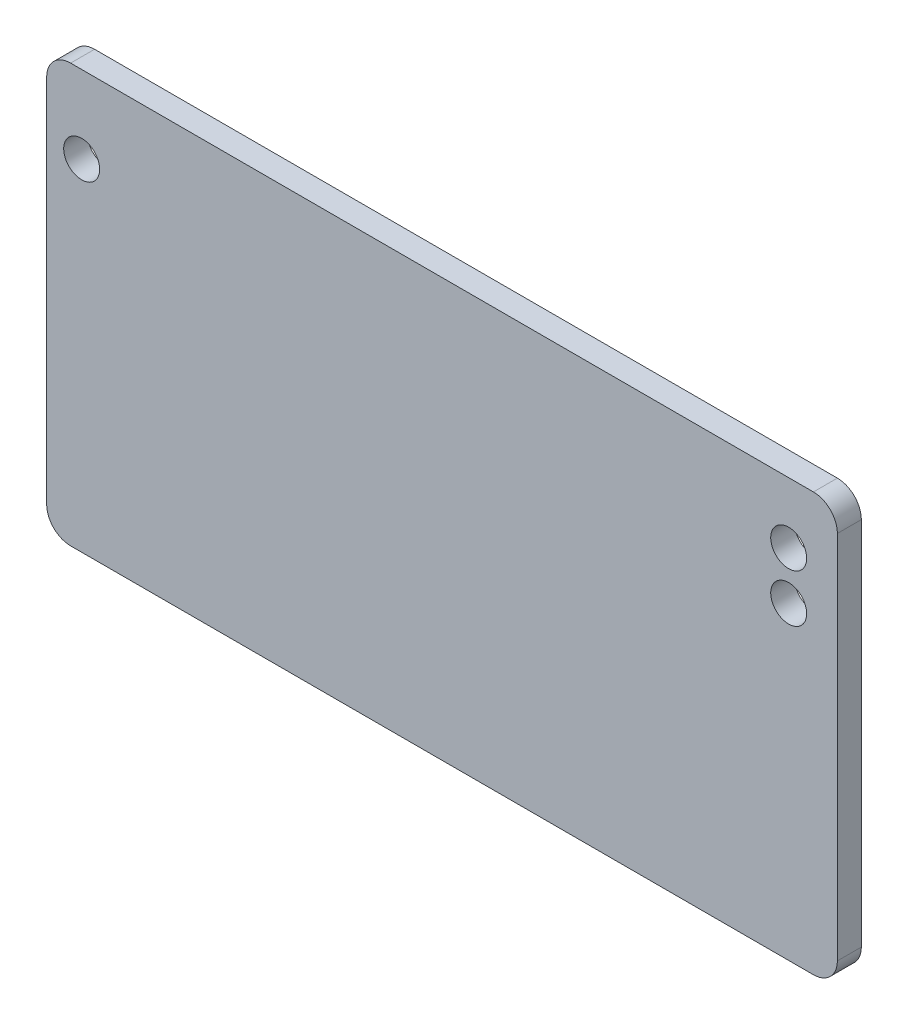
ISO-10303-21;
HEADER;
FILE_DESCRIPTION(('STEP AP214'),'2;1');
FILE_NAME('part.step','',(''),(''),'','','');
FILE_SCHEMA(('AUTOMOTIVE_DESIGN { 1 0 10303 214 1 1 1 1 }'));
ENDSEC;
DATA;
#1=APPLICATION_CONTEXT('core data for automotive mechanical design processes');
#2=APPLICATION_PROTOCOL_DEFINITION('international standard','automotive_design',2000,#1);
#3=PRODUCT_CONTEXT('',#1,'mechanical');
#4=PRODUCT('Part','Part','',(#3));
#5=PRODUCT_RELATED_PRODUCT_CATEGORY('part','',(#4));
#6=PRODUCT_DEFINITION_FORMATION('','',#4);
#7=PRODUCT_DEFINITION_CONTEXT('part definition',#1,'design');
#8=PRODUCT_DEFINITION('design','',#6,#7);
#9=PRODUCT_DEFINITION_SHAPE('','',#8);
#10=(LENGTH_UNIT() NAMED_UNIT(*) SI_UNIT(.MILLI.,.METRE.));
#11=(NAMED_UNIT(*) PLANE_ANGLE_UNIT() SI_UNIT($,.RADIAN.));
#12=(NAMED_UNIT(*) SI_UNIT($,.STERADIAN.) SOLID_ANGLE_UNIT());
#13=UNCERTAINTY_MEASURE_WITH_UNIT(LENGTH_MEASURE(1.E-05),#10,'distance_accuracy_value','');
#14=(GEOMETRIC_REPRESENTATION_CONTEXT(3) GLOBAL_UNCERTAINTY_ASSIGNED_CONTEXT((#13)) GLOBAL_UNIT_ASSIGNED_CONTEXT((#10,
#11,#12)) REPRESENTATION_CONTEXT('',''));
#15=CARTESIAN_POINT('',(0.,0.,0.));
#16=DIRECTION('',(0.,0.,1.));
#17=DIRECTION('',(1.,0.,0.));
#18=AXIS2_PLACEMENT_3D('',#15,#16,#17);
#19=CARTESIAN_POINT('',(31.9060301507538,12.0367629378379,2.));
#20=DIRECTION('',(0.,0.,-1.));
#21=DIRECTION('',(-1.,0.,0.));
#22=AXIS2_PLACEMENT_3D('',#19,#20,#21);
#23=CYLINDRICAL_SURFACE('',#22,2.);
#24=CARTESIAN_POINT('',(31.9060301507538,12.0367629378379,0.));
#25=DIRECTION('',(0.,0.,1.));
#26=DIRECTION('',(1.,0.,0.));
#27=AXIS2_PLACEMENT_3D('',#24,#25,#26);
#28=CIRCLE('',#27,2.);
#29=CARTESIAN_POINT('',(33.9060301507538,12.0367629378379,0.));
#30=VERTEX_POINT('',#29);
#31=CARTESIAN_POINT('',(31.9060301507538,14.0367629378379,0.));
#32=VERTEX_POINT('',#31);
#33=EDGE_CURVE('E143',#30,#32,#28,.T.);
#34=ORIENTED_EDGE('',*,*,#33,.T.);
#35=DIRECTION('',(0.,0.,-1.));
#36=VECTOR('',#35,1.);
#37=CARTESIAN_POINT('',(31.9060301507538,14.0367629378379,2.));
#38=LINE('',#37,#36);
#39=CARTESIAN_POINT('',(31.9060301507538,14.0367629378379,2.));
#40=VERTEX_POINT('',#39);
#41=EDGE_CURVE('E11',#40,#32,#38,.T.);
#42=ORIENTED_EDGE('',*,*,#41,.F.);
#43=CARTESIAN_POINT('',(31.9060301507538,12.0367629378379,2.));
#44=DIRECTION('',(0.,0.,1.));
#45=DIRECTION('',(1.,0.,0.));
#46=AXIS2_PLACEMENT_3D('',#43,#44,#45);
#47=CIRCLE('',#46,2.);
#48=CARTESIAN_POINT('',(33.9060301507538,12.0367629378379,2.));
#49=VERTEX_POINT('',#48);
#50=EDGE_CURVE('E157',#49,#40,#47,.T.);
#51=ORIENTED_EDGE('',*,*,#50,.F.);
#52=DIRECTION('',(0.,0.,-1.));
#53=VECTOR('',#52,1.);
#54=CARTESIAN_POINT('',(33.9060301507538,12.0367629378379,2.));
#55=LINE('',#54,#53);
#56=EDGE_CURVE('E139',#49,#30,#55,.T.);
#57=ORIENTED_EDGE('',*,*,#56,.T.);
#58=EDGE_LOOP('',(#34,#42,#51,#57));
#59=FACE_BOUND('',#58,.T.);
#60=ADVANCED_FACE('F45',(#59),#23,.T.);
#61=CARTESIAN_POINT('',(-30.0939698492462,14.0367629378379,2.));
#62=DIRECTION('',(0.,-1.,0.));
#63=DIRECTION('',(0.,0.,-1.));
#64=AXIS2_PLACEMENT_3D('',#61,#62,#63);
#65=PLANE('',#64);
#66=DIRECTION('',(-1.,0.,0.));
#67=VECTOR('',#66,1.);
#68=CARTESIAN_POINT('',(-30.0939698492462,14.0367629378379,0.));
#69=LINE('',#68,#67);
#70=CARTESIAN_POINT('',(-30.0939698492462,14.0367629378379,0.));
#71=VERTEX_POINT('',#70);
#72=EDGE_CURVE('E146',#32,#71,#69,.T.);
#73=ORIENTED_EDGE('',*,*,#72,.T.);
#74=DIRECTION('',(0.,0.,-1.));
#75=VECTOR('',#74,1.);
#76=CARTESIAN_POINT('',(-30.0939698492462,14.0367629378379,2.));
#77=LINE('',#76,#75);
#78=CARTESIAN_POINT('',(-30.0939698492462,14.0367629378379,2.));
#79=VERTEX_POINT('',#78);
#80=EDGE_CURVE('E54',#79,#71,#77,.T.);
#81=ORIENTED_EDGE('',*,*,#80,.F.);
#82=DIRECTION('',(-1.,0.,0.));
#83=VECTOR('',#82,1.);
#84=CARTESIAN_POINT('',(-30.0939698492462,14.0367629378379,2.));
#85=LINE('',#84,#83);
#86=EDGE_CURVE('E106',#40,#79,#85,.T.);
#87=ORIENTED_EDGE('',*,*,#86,.F.);
#88=ORIENTED_EDGE('',*,*,#41,.T.);
#89=EDGE_LOOP('',(#73,#81,#87,#88));
#90=FACE_BOUND('',#89,.T.);
#91=ADVANCED_FACE('F194',(#90),#65,.F.);
#92=CARTESIAN_POINT('',(-30.0939698492462,12.0367629378379,2.));
#93=DIRECTION('',(0.,0.,-1.));
#94=DIRECTION('',(-1.,0.,0.));
#95=AXIS2_PLACEMENT_3D('',#92,#93,#94);
#96=CYLINDRICAL_SURFACE('',#95,2.);
#97=CARTESIAN_POINT('',(-30.0939698492462,12.0367629378379,0.));
#98=DIRECTION('',(0.,0.,1.));
#99=DIRECTION('',(-1.,0.,0.));
#100=AXIS2_PLACEMENT_3D('',#97,#98,#99);
#101=CIRCLE('',#100,2.);
#102=CARTESIAN_POINT('',(-32.0939698492462,12.0367629378379,0.));
#103=VERTEX_POINT('',#102);
#104=EDGE_CURVE('E148',#71,#103,#101,.T.);
#105=ORIENTED_EDGE('',*,*,#104,.T.);
#106=DIRECTION('',(0.,0.,-1.));
#107=VECTOR('',#106,1.);
#108=CARTESIAN_POINT('',(-32.0939698492462,12.0367629378379,2.));
#109=LINE('',#108,#107);
#110=CARTESIAN_POINT('',(-32.0939698492462,12.0367629378379,2.));
#111=VERTEX_POINT('',#110);
#112=EDGE_CURVE('E164',#111,#103,#109,.T.);
#113=ORIENTED_EDGE('',*,*,#112,.F.);
#114=CARTESIAN_POINT('',(-30.0939698492462,12.0367629378379,2.));
#115=DIRECTION('',(0.,0.,1.));
#116=DIRECTION('',(-1.,0.,0.));
#117=AXIS2_PLACEMENT_3D('',#114,#115,#116);
#118=CIRCLE('',#117,2.);
#119=EDGE_CURVE('E209',#79,#111,#118,.T.);
#120=ORIENTED_EDGE('',*,*,#119,.F.);
#121=ORIENTED_EDGE('',*,*,#80,.T.);
#122=EDGE_LOOP('',(#105,#113,#120,#121));
#123=FACE_BOUND('',#122,.T.);
#124=ADVANCED_FACE('F199',(#123),#96,.T.);
#125=CARTESIAN_POINT('',(-32.0939698492462,12.0367629378379,2.));
#126=DIRECTION('',(1.,0.,0.));
#127=DIRECTION('',(0.,0.,-1.));
#128=AXIS2_PLACEMENT_3D('',#125,#126,#127);
#129=PLANE('',#128);
#130=DIRECTION('',(0.,-1.,0.));
#131=VECTOR('',#130,1.);
#132=CARTESIAN_POINT('',(-32.0939698492462,12.0367629378379,0.));
#133=LINE('',#132,#131);
#134=CARTESIAN_POINT('',(-32.0939698492462,-18.8632370621621,0.));
#135=VERTEX_POINT('',#134);
#136=EDGE_CURVE('E150',#103,#135,#133,.T.);
#137=ORIENTED_EDGE('',*,*,#136,.T.);
#138=DIRECTION('',(0.,0.,-1.));
#139=VECTOR('',#138,1.);
#140=CARTESIAN_POINT('',(-32.0939698492462,-18.8632370621621,2.));
#141=LINE('',#140,#139);
#142=CARTESIAN_POINT('',(-32.0939698492462,-18.8632370621621,2.));
#143=VERTEX_POINT('',#142);
#144=EDGE_CURVE('E161',#143,#135,#141,.T.);
#145=ORIENTED_EDGE('',*,*,#144,.F.);
#146=DIRECTION('',(0.,-1.,0.));
#147=VECTOR('',#146,1.);
#148=CARTESIAN_POINT('',(-32.0939698492462,12.0367629378379,2.));
#149=LINE('',#148,#147);
#150=EDGE_CURVE('E211',#111,#143,#149,.T.);
#151=ORIENTED_EDGE('',*,*,#150,.F.);
#152=ORIENTED_EDGE('',*,*,#112,.T.);
#153=EDGE_LOOP('',(#137,#145,#151,#152));
#154=FACE_BOUND('',#153,.T.);
#155=ADVANCED_FACE('F252',(#154),#129,.F.);
#156=CARTESIAN_POINT('',(-30.0939698492462,-18.8632370621621,2.));
#157=DIRECTION('',(0.,0.,-1.));
#158=DIRECTION('',(-1.,0.,0.));
#159=AXIS2_PLACEMENT_3D('',#156,#157,#158);
#160=CYLINDRICAL_SURFACE('',#159,2.);
#161=CARTESIAN_POINT('',(-30.0939698492462,-18.8632370621621,0.));
#162=DIRECTION('',(0.,0.,1.));
#163=DIRECTION('',(-1.,0.,0.));
#164=AXIS2_PLACEMENT_3D('',#161,#162,#163);
#165=CIRCLE('',#164,2.);
#166=CARTESIAN_POINT('',(-30.0939698492462,-20.8632370621621,0.));
#167=VERTEX_POINT('',#166);
#168=EDGE_CURVE('E152',#135,#167,#165,.T.);
#169=ORIENTED_EDGE('',*,*,#168,.T.);
#170=DIRECTION('',(0.,0.,-1.));
#171=VECTOR('',#170,1.);
#172=CARTESIAN_POINT('',(-30.0939698492462,-20.8632370621621,2.));
#173=LINE('',#172,#171);
#174=CARTESIAN_POINT('',(-30.0939698492462,-20.8632370621621,2.));
#175=VERTEX_POINT('',#174);
#176=EDGE_CURVE('E134',#175,#167,#173,.T.);
#177=ORIENTED_EDGE('',*,*,#176,.F.);
#178=CARTESIAN_POINT('',(-30.0939698492462,-18.8632370621621,2.));
#179=DIRECTION('',(0.,0.,1.));
#180=DIRECTION('',(-1.,0.,0.));
#181=AXIS2_PLACEMENT_3D('',#178,#179,#180);
#182=CIRCLE('',#181,2.);
#183=EDGE_CURVE('E125',#143,#175,#182,.T.);
#184=ORIENTED_EDGE('',*,*,#183,.F.);
#185=ORIENTED_EDGE('',*,*,#144,.T.);
#186=EDGE_LOOP('',(#169,#177,#184,#185));
#187=FACE_BOUND('',#186,.T.);
#188=ADVANCED_FACE('F249',(#187),#160,.T.);
#189=CARTESIAN_POINT('',(-30.0939698492462,-20.8632370621621,2.));
#190=DIRECTION('',(0.,1.,0.));
#191=DIRECTION('',(0.,0.,1.));
#192=AXIS2_PLACEMENT_3D('',#189,#190,#191);
#193=PLANE('',#192);
#194=DIRECTION('',(1.,0.,0.));
#195=VECTOR('',#194,1.);
#196=CARTESIAN_POINT('',(-30.0939698492462,-20.8632370621621,0.));
#197=LINE('',#196,#195);
#198=CARTESIAN_POINT('',(31.9060301507538,-20.8632370621621,0.));
#199=VERTEX_POINT('',#198);
#200=EDGE_CURVE('E133',#167,#199,#197,.T.);
#201=ORIENTED_EDGE('',*,*,#200,.T.);
#202=DIRECTION('',(0.,0.,-1.));
#203=VECTOR('',#202,1.);
#204=CARTESIAN_POINT('',(31.9060301507538,-20.8632370621621,2.));
#205=LINE('',#204,#203);
#206=CARTESIAN_POINT('',(31.9060301507538,-20.8632370621621,2.));
#207=VERTEX_POINT('',#206);
#208=EDGE_CURVE('E130',#207,#199,#205,.T.);
#209=ORIENTED_EDGE('',*,*,#208,.F.);
#210=DIRECTION('',(1.,0.,0.));
#211=VECTOR('',#210,1.);
#212=CARTESIAN_POINT('',(-30.0939698492462,-20.8632370621621,2.));
#213=LINE('',#212,#211);
#214=EDGE_CURVE('E119',#175,#207,#213,.T.);
#215=ORIENTED_EDGE('',*,*,#214,.F.);
#216=ORIENTED_EDGE('',*,*,#176,.T.);
#217=EDGE_LOOP('',(#201,#209,#215,#216));
#218=FACE_BOUND('',#217,.T.);
#219=ADVANCED_FACE('F131',(#218),#193,.F.);
#220=CARTESIAN_POINT('',(31.9060301507538,-18.8632370621621,2.));
#221=DIRECTION('',(0.,0.,-1.));
#222=DIRECTION('',(-1.,0.,0.));
#223=AXIS2_PLACEMENT_3D('',#220,#221,#222);
#224=CYLINDRICAL_SURFACE('',#223,2.);
#225=CARTESIAN_POINT('',(31.9060301507538,-18.8632370621621,0.));
#226=DIRECTION('',(0.,0.,1.));
#227=DIRECTION('',(1.,0.,0.));
#228=AXIS2_PLACEMENT_3D('',#225,#226,#227);
#229=CIRCLE('',#228,2.);
#230=CARTESIAN_POINT('',(33.9060301507538,-18.8632370621621,0.));
#231=VERTEX_POINT('',#230);
#232=EDGE_CURVE('E92',#199,#231,#229,.T.);
#233=ORIENTED_EDGE('',*,*,#232,.T.);
#234=DIRECTION('',(0.,0.,-1.));
#235=VECTOR('',#234,1.);
#236=CARTESIAN_POINT('',(33.9060301507538,-18.8632370621621,2.));
#237=LINE('',#236,#235);
#238=CARTESIAN_POINT('',(33.9060301507538,-18.8632370621621,2.));
#239=VERTEX_POINT('',#238);
#240=EDGE_CURVE('E135',#239,#231,#237,.T.);
#241=ORIENTED_EDGE('',*,*,#240,.F.);
#242=CARTESIAN_POINT('',(31.9060301507538,-18.8632370621621,2.));
#243=DIRECTION('',(0.,0.,1.));
#244=DIRECTION('',(1.,0.,0.));
#245=AXIS2_PLACEMENT_3D('',#242,#243,#244);
#246=CIRCLE('',#245,2.);
#247=EDGE_CURVE('E123',#207,#239,#246,.T.);
#248=ORIENTED_EDGE('',*,*,#247,.F.);
#249=ORIENTED_EDGE('',*,*,#208,.T.);
#250=EDGE_LOOP('',(#233,#241,#248,#249));
#251=FACE_BOUND('',#250,.T.);
#252=ADVANCED_FACE('F137',(#251),#224,.T.);
#253=CARTESIAN_POINT('',(33.9060301507538,12.0367629378379,2.));
#254=DIRECTION('',(-1.,0.,0.));
#255=DIRECTION('',(0.,0.,1.));
#256=AXIS2_PLACEMENT_3D('',#253,#254,#255);
#257=PLANE('',#256);
#258=DIRECTION('',(0.,1.,0.));
#259=VECTOR('',#258,1.);
#260=CARTESIAN_POINT('',(33.9060301507538,12.0367629378379,0.));
#261=LINE('',#260,#259);
#262=EDGE_CURVE('E98',#231,#30,#261,.T.);
#263=ORIENTED_EDGE('',*,*,#262,.T.);
#264=ORIENTED_EDGE('',*,*,#56,.F.);
#265=DIRECTION('',(0.,1.,0.));
#266=VECTOR('',#265,1.);
#267=CARTESIAN_POINT('',(33.9060301507538,12.0367629378379,2.));
#268=LINE('',#267,#266);
#269=EDGE_CURVE('E63',#239,#49,#268,.T.);
#270=ORIENTED_EDGE('',*,*,#269,.F.);
#271=ORIENTED_EDGE('',*,*,#240,.T.);
#272=EDGE_LOOP('',(#263,#264,#270,#271));
#273=FACE_BOUND('',#272,.T.);
#274=ADVANCED_FACE('F227',(#273),#257,.F.);
#275=CARTESIAN_POINT('',(31.9060301507538,12.0367629378379,2.));
#276=DIRECTION('',(0.,0.,1.));
#277=DIRECTION('',(1.,0.,0.));
#278=AXIS2_PLACEMENT_3D('',#275,#276,#277);
#279=PLANE('',#278);
#280=CARTESIAN_POINT('',(-29.1729698492462,7.55976293783788,2.));
#281=DIRECTION('',(0.,0.,1.));
#282=DIRECTION('',(1.,0.,0.));
#283=AXIS2_PLACEMENT_3D('',#280,#281,#282);
#284=CIRCLE('',#283,1.5);
#285=CARTESIAN_POINT('',(-27.6729698492462,7.55976293783788,2.));
#286=VERTEX_POINT('',#285);
#287=EDGE_CURVE('E172',#286,#286,#284,.T.);
#288=ORIENTED_EDGE('',*,*,#287,.F.);
#289=EDGE_LOOP('',(#288));
#290=FACE_BOUND('',#289,.T.);
#291=CARTESIAN_POINT('',(29.8420301507538,8.95676293783788,2.));
#292=DIRECTION('',(0.,0.,1.));
#293=DIRECTION('',(1.,0.,0.));
#294=AXIS2_PLACEMENT_3D('',#291,#292,#293);
#295=CIRCLE('',#294,1.5);
#296=CARTESIAN_POINT('',(31.3420301507538,8.95676293783788,2.));
#297=VERTEX_POINT('',#296);
#298=EDGE_CURVE('E220',#297,#297,#295,.T.);
#299=ORIENTED_EDGE('',*,*,#298,.F.);
#300=EDGE_LOOP('',(#299));
#301=FACE_BOUND('',#300,.T.);
#302=CARTESIAN_POINT('',(29.8420301507538,4.95676293783788,2.));
#303=DIRECTION('',(0.,0.,1.));
#304=DIRECTION('',(1.,0.,0.));
#305=AXIS2_PLACEMENT_3D('',#302,#303,#304);
#306=CIRCLE('',#305,1.5);
#307=CARTESIAN_POINT('',(31.3420301507538,4.95676293783788,2.));
#308=VERTEX_POINT('',#307);
#309=EDGE_CURVE('E217',#308,#308,#306,.T.);
#310=ORIENTED_EDGE('',*,*,#309,.F.);
#311=EDGE_LOOP('',(#310));
#312=FACE_BOUND('',#311,.T.);
#313=ORIENTED_EDGE('',*,*,#50,.T.);
#314=ORIENTED_EDGE('',*,*,#86,.T.);
#315=ORIENTED_EDGE('',*,*,#119,.T.);
#316=ORIENTED_EDGE('',*,*,#150,.T.);
#317=ORIENTED_EDGE('',*,*,#183,.T.);
#318=ORIENTED_EDGE('',*,*,#214,.T.);
#319=ORIENTED_EDGE('',*,*,#247,.T.);
#320=ORIENTED_EDGE('',*,*,#269,.T.);
#321=EDGE_LOOP('',(#313,#314,#315,#316,#317,#318,#319,#320));
#322=FACE_BOUND('',#321,.T.);
#323=ADVANCED_FACE('F121',(#290,#301,#312,#322),#279,.T.);
#324=CARTESIAN_POINT('',(31.9060301507538,12.0367629378379,0.));
#325=DIRECTION('',(0.,0.,1.));
#326=DIRECTION('',(1.,0.,0.));
#327=AXIS2_PLACEMENT_3D('',#324,#325,#326);
#328=PLANE('',#327);
#329=CARTESIAN_POINT('',(-29.1729698492462,7.55976293783788,0.));
#330=DIRECTION('',(0.,0.,1.));
#331=DIRECTION('',(1.,0.,0.));
#332=AXIS2_PLACEMENT_3D('',#329,#330,#331);
#333=CIRCLE('',#332,1.5);
#334=CARTESIAN_POINT('',(-27.6729698492462,7.55976293783788,0.));
#335=VERTEX_POINT('',#334);
#336=EDGE_CURVE('E48',#335,#335,#333,.T.);
#337=ORIENTED_EDGE('',*,*,#336,.T.);
#338=EDGE_LOOP('',(#337));
#339=FACE_BOUND('',#338,.T.);
#340=CARTESIAN_POINT('',(29.8420301507538,8.95676293783788,0.));
#341=DIRECTION('',(0.,0.,1.));
#342=DIRECTION('',(1.,0.,0.));
#343=AXIS2_PLACEMENT_3D('',#340,#341,#342);
#344=CIRCLE('',#343,1.5);
#345=CARTESIAN_POINT('',(31.3420301507538,8.95676293783788,0.));
#346=VERTEX_POINT('',#345);
#347=EDGE_CURVE('E171',#346,#346,#344,.T.);
#348=ORIENTED_EDGE('',*,*,#347,.T.);
#349=EDGE_LOOP('',(#348));
#350=FACE_BOUND('',#349,.T.);
#351=CARTESIAN_POINT('',(29.8420301507538,4.95676293783788,0.));
#352=DIRECTION('',(0.,0.,1.));
#353=DIRECTION('',(1.,0.,0.));
#354=AXIS2_PLACEMENT_3D('',#351,#352,#353);
#355=CIRCLE('',#354,1.5);
#356=CARTESIAN_POINT('',(31.3420301507538,4.95676293783788,0.));
#357=VERTEX_POINT('',#356);
#358=EDGE_CURVE('E169',#357,#357,#355,.T.);
#359=ORIENTED_EDGE('',*,*,#358,.T.);
#360=EDGE_LOOP('',(#359));
#361=FACE_BOUND('',#360,.T.);
#362=ORIENTED_EDGE('',*,*,#33,.F.);
#363=ORIENTED_EDGE('',*,*,#262,.F.);
#364=ORIENTED_EDGE('',*,*,#232,.F.);
#365=ORIENTED_EDGE('',*,*,#200,.F.);
#366=ORIENTED_EDGE('',*,*,#168,.F.);
#367=ORIENTED_EDGE('',*,*,#136,.F.);
#368=ORIENTED_EDGE('',*,*,#104,.F.);
#369=ORIENTED_EDGE('',*,*,#72,.F.);
#370=EDGE_LOOP('',(#362,#363,#364,#365,#366,#367,#368,#369));
#371=FACE_BOUND('',#370,.T.);
#372=ADVANCED_FACE('F179',(#339,#350,#361,#371),#328,.F.);
#373=CARTESIAN_POINT('',(29.8420301507538,4.95676293783788,-1.));
#374=DIRECTION('',(0.,0.,1.));
#375=DIRECTION('',(1.,0.,0.));
#376=AXIS2_PLACEMENT_3D('',#373,#374,#375);
#377=CYLINDRICAL_SURFACE('',#376,1.5);
#378=ORIENTED_EDGE('',*,*,#309,.T.);
#379=EDGE_LOOP('',(#378));
#380=FACE_BOUND('',#379,.T.);
#381=ORIENTED_EDGE('',*,*,#358,.F.);
#382=EDGE_LOOP('',(#381));
#383=FACE_BOUND('',#382,.T.);
#384=ADVANCED_FACE('F189',(#380,#383),#377,.F.);
#385=CARTESIAN_POINT('',(29.8420301507538,8.95676293783788,-1.));
#386=DIRECTION('',(0.,0.,1.));
#387=DIRECTION('',(1.,0.,0.));
#388=AXIS2_PLACEMENT_3D('',#385,#386,#387);
#389=CYLINDRICAL_SURFACE('',#388,1.5);
#390=ORIENTED_EDGE('',*,*,#298,.T.);
#391=EDGE_LOOP('',(#390));
#392=FACE_BOUND('',#391,.T.);
#393=ORIENTED_EDGE('',*,*,#347,.F.);
#394=EDGE_LOOP('',(#393));
#395=FACE_BOUND('',#394,.T.);
#396=ADVANCED_FACE('F183',(#392,#395),#389,.F.);
#397=CARTESIAN_POINT('',(-29.1729698492462,7.55976293783788,-1.));
#398=DIRECTION('',(0.,0.,1.));
#399=DIRECTION('',(1.,0.,0.));
#400=AXIS2_PLACEMENT_3D('',#397,#398,#399);
#401=CYLINDRICAL_SURFACE('',#400,1.5);
#402=ORIENTED_EDGE('',*,*,#287,.T.);
#403=EDGE_LOOP('',(#402));
#404=FACE_BOUND('',#403,.T.);
#405=ORIENTED_EDGE('',*,*,#336,.F.);
#406=EDGE_LOOP('',(#405));
#407=FACE_BOUND('',#406,.T.);
#408=ADVANCED_FACE('F181',(#404,#407),#401,.F.);
#409=CLOSED_SHELL('',(#60,#91,#124,#155,#188,#219,#252,#274,#323,#372,#384,#396,#408));
#410=MANIFOLD_SOLID_BREP('B2',#409);
#411=ADVANCED_BREP_SHAPE_REPRESENTATION('',(#18,#410),#14);
#412=SHAPE_DEFINITION_REPRESENTATION(#9,#411);
ENDSEC;
END-ISO-10303-21;
